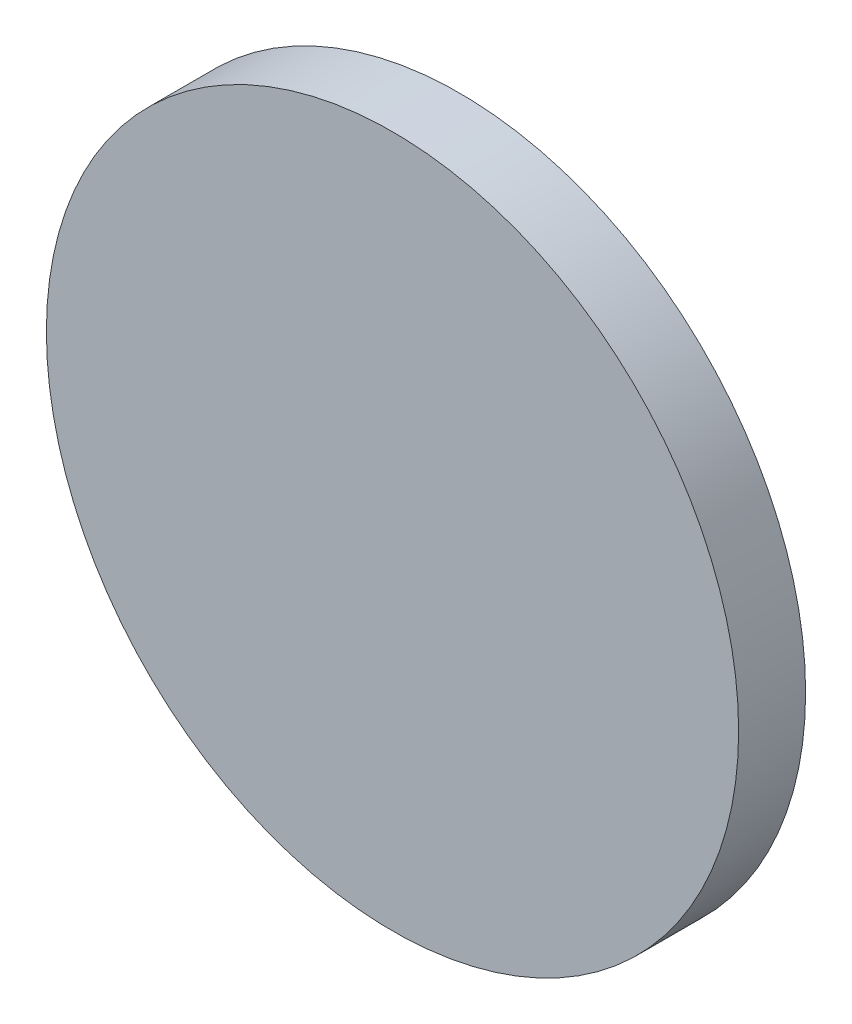
ISO-10303-21;
HEADER;
FILE_DESCRIPTION(('STEP AP214'),'2;1');
FILE_NAME('part.step','',(''),(''),'','','');
FILE_SCHEMA(('AUTOMOTIVE_DESIGN { 1 0 10303 214 1 1 1 1 }'));
ENDSEC;
DATA;
#1=APPLICATION_CONTEXT('core data for automotive mechanical design processes');
#2=APPLICATION_PROTOCOL_DEFINITION('international standard','automotive_design',2000,#1);
#3=PRODUCT_CONTEXT('',#1,'mechanical');
#4=PRODUCT('Part','Part','',(#3));
#5=PRODUCT_RELATED_PRODUCT_CATEGORY('part','',(#4));
#6=PRODUCT_DEFINITION_FORMATION('','',#4);
#7=PRODUCT_DEFINITION_CONTEXT('part definition',#1,'design');
#8=PRODUCT_DEFINITION('design','',#6,#7);
#9=PRODUCT_DEFINITION_SHAPE('','',#8);
#10=(LENGTH_UNIT() NAMED_UNIT(*) SI_UNIT(.MILLI.,.METRE.));
#11=(NAMED_UNIT(*) PLANE_ANGLE_UNIT() SI_UNIT($,.RADIAN.));
#12=(NAMED_UNIT(*) SI_UNIT($,.STERADIAN.) SOLID_ANGLE_UNIT());
#13=UNCERTAINTY_MEASURE_WITH_UNIT(LENGTH_MEASURE(1.E-05),#10,'distance_accuracy_value','');
#14=(GEOMETRIC_REPRESENTATION_CONTEXT(3) GLOBAL_UNCERTAINTY_ASSIGNED_CONTEXT((#13)) GLOBAL_UNIT_ASSIGNED_CONTEXT((#10,
#11,#12)) REPRESENTATION_CONTEXT('',''));
#15=CARTESIAN_POINT('',(0.,0.,0.));
#16=DIRECTION('',(0.,0.,1.));
#17=DIRECTION('',(1.,0.,0.));
#18=AXIS2_PLACEMENT_3D('',#15,#16,#17);
#19=CARTESIAN_POINT('',(0.,0.,3.175));
#20=DIRECTION('',(0.,0.,-1.));
#21=DIRECTION('',(-1.,0.,0.));
#22=AXIS2_PLACEMENT_3D('',#19,#20,#21);
#23=CYLINDRICAL_SURFACE('',#22,16.4084);
#24=CARTESIAN_POINT('',(0.,0.,3.175));
#25=DIRECTION('',(0.,0.,1.));
#26=DIRECTION('',(1.,0.,0.));
#27=AXIS2_PLACEMENT_3D('',#24,#25,#26);
#28=CIRCLE('',#27,16.4084);
#29=CARTESIAN_POINT('',(16.4084,0.,3.175));
#30=VERTEX_POINT('',#29);
#31=EDGE_CURVE('E10',#30,#30,#28,.T.);
#32=ORIENTED_EDGE('',*,*,#31,.F.);
#33=EDGE_LOOP('',(#32));
#34=FACE_BOUND('',#33,.T.);
#35=CARTESIAN_POINT('',(0.,0.,0.));
#36=DIRECTION('',(0.,0.,1.));
#37=DIRECTION('',(1.,0.,0.));
#38=AXIS2_PLACEMENT_3D('',#35,#36,#37);
#39=CIRCLE('',#38,16.4084);
#40=CARTESIAN_POINT('',(16.4084,0.,0.));
#41=VERTEX_POINT('',#40);
#42=EDGE_CURVE('E34',#41,#41,#39,.T.);
#43=ORIENTED_EDGE('',*,*,#42,.T.);
#44=EDGE_LOOP('',(#43));
#45=FACE_BOUND('',#44,.T.);
#46=ADVANCED_FACE('F31',(#34,#45),#23,.T.);
#47=CARTESIAN_POINT('',(0.,0.,3.175));
#48=DIRECTION('',(0.,0.,1.));
#49=DIRECTION('',(1.,0.,0.));
#50=AXIS2_PLACEMENT_3D('',#47,#48,#49);
#51=PLANE('',#50);
#52=ORIENTED_EDGE('',*,*,#31,.T.);
#53=EDGE_LOOP('',(#52));
#54=FACE_BOUND('',#53,.T.);
#55=ADVANCED_FACE('F46',(#54),#51,.T.);
#56=CARTESIAN_POINT('',(0.,0.,0.));
#57=DIRECTION('',(0.,0.,1.));
#58=DIRECTION('',(1.,0.,0.));
#59=AXIS2_PLACEMENT_3D('',#56,#57,#58);
#60=PLANE('',#59);
#61=ORIENTED_EDGE('',*,*,#42,.F.);
#62=EDGE_LOOP('',(#61));
#63=FACE_BOUND('',#62,.T.);
#64=ADVANCED_FACE('F44',(#63),#60,.F.);
#65=CLOSED_SHELL('',(#46,#55,#64));
#66=MANIFOLD_SOLID_BREP('B2',#65);
#67=ADVANCED_BREP_SHAPE_REPRESENTATION('',(#18,#66),#14);
#68=SHAPE_DEFINITION_REPRESENTATION(#9,#67);
ENDSEC;
END-ISO-10303-21;
